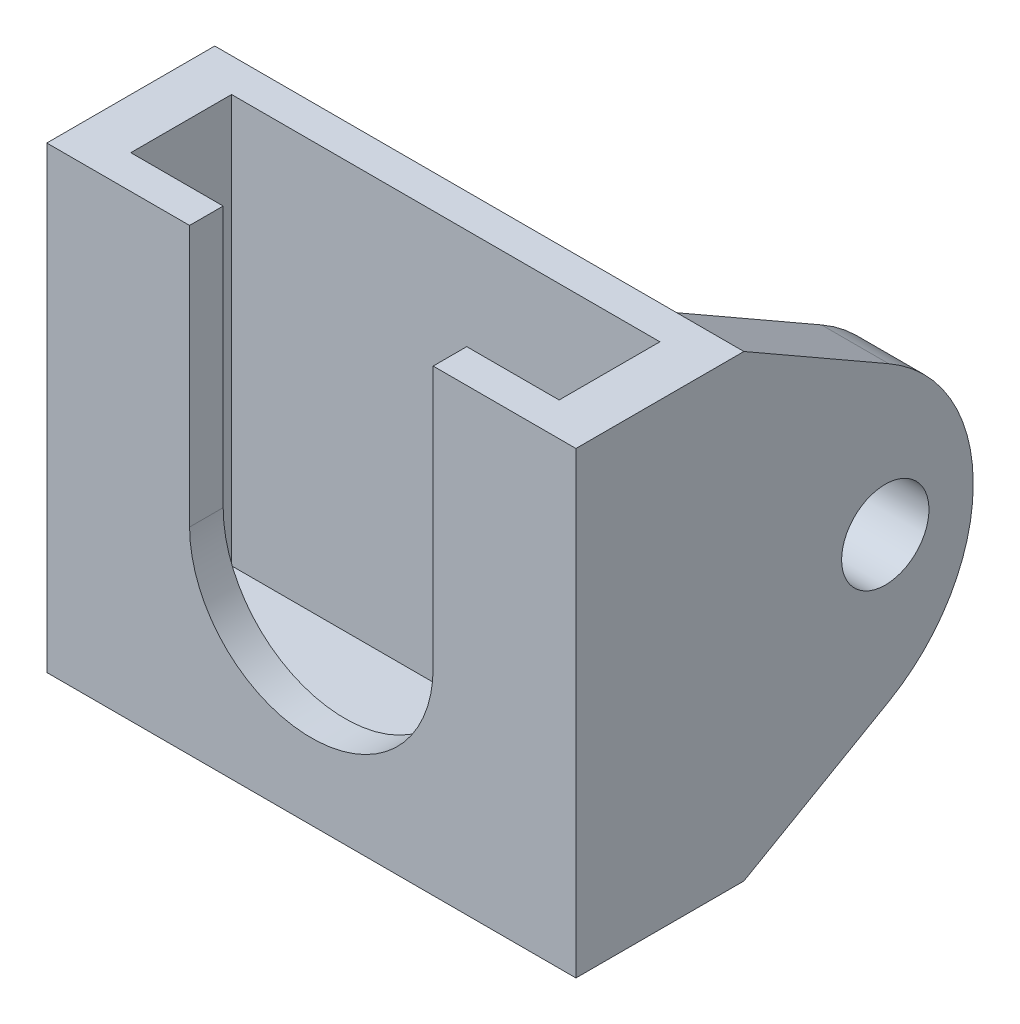
ISO-10303-21;
HEADER;
FILE_DESCRIPTION(('STEP AP214'),'2;1');
FILE_NAME('part.step','',(''),(''),'','','');
FILE_SCHEMA(('AUTOMOTIVE_DESIGN { 1 0 10303 214 1 1 1 1 }'));
ENDSEC;
DATA;
#1=APPLICATION_CONTEXT('core data for automotive mechanical design processes');
#2=APPLICATION_PROTOCOL_DEFINITION('international standard','automotive_design',2000,#1);
#3=PRODUCT_CONTEXT('',#1,'mechanical');
#4=PRODUCT('Part','Part','',(#3));
#5=PRODUCT_RELATED_PRODUCT_CATEGORY('part','',(#4));
#6=PRODUCT_DEFINITION_FORMATION('','',#4);
#7=PRODUCT_DEFINITION_CONTEXT('part definition',#1,'design');
#8=PRODUCT_DEFINITION('design','',#6,#7);
#9=PRODUCT_DEFINITION_SHAPE('','',#8);
#10=(LENGTH_UNIT() NAMED_UNIT(*) SI_UNIT(.MILLI.,.METRE.));
#11=(NAMED_UNIT(*) PLANE_ANGLE_UNIT() SI_UNIT($,.RADIAN.));
#12=(NAMED_UNIT(*) SI_UNIT($,.STERADIAN.) SOLID_ANGLE_UNIT());
#13=UNCERTAINTY_MEASURE_WITH_UNIT(LENGTH_MEASURE(1.E-05),#10,'distance_accuracy_value','');
#14=(GEOMETRIC_REPRESENTATION_CONTEXT(3) GLOBAL_UNCERTAINTY_ASSIGNED_CONTEXT((#13)) GLOBAL_UNIT_ASSIGNED_CONTEXT((#10,
#11,#12)) REPRESENTATION_CONTEXT('',''));
#15=CARTESIAN_POINT('',(0.,0.,0.));
#16=DIRECTION('',(0.,0.,1.));
#17=DIRECTION('',(1.,0.,0.));
#18=AXIS2_PLACEMENT_3D('',#15,#16,#17);
#19=CARTESIAN_POINT('',(28.5,-3.,6.));
#20=DIRECTION('',(-1.,0.,0.));
#21=DIRECTION('',(0.,0.,1.));
#22=AXIS2_PLACEMENT_3D('',#19,#20,#21);
#23=PLANE('',#22);
#24=CARTESIAN_POINT('',(28.5,10.65,-10.4161328959576));
#25=DIRECTION('',(-1.,0.,0.));
#26=DIRECTION('',(0.,0.,1.));
#27=AXIS2_PLACEMENT_3D('',#24,#25,#26);
#28=CIRCLE('',#27,2.6);
#29=CARTESIAN_POINT('',(28.5,10.65,-7.81613289595758));
#30=VERTEX_POINT('',#29);
#31=EDGE_CURVE('E163',#30,#30,#28,.T.);
#32=ORIENTED_EDGE('',*,*,#31,.T.);
#33=EDGE_LOOP('',(#32));
#34=FACE_BOUND('',#33,.T.);
#35=DIRECTION('',(0.,0.49706783095096,-0.867711686814064));
#36=VECTOR('',#35,1.);
#37=CARTESIAN_POINT('',(28.5,-6.45049252844372,4.02338857146966));
#38=LINE('',#37,#36);
#39=CARTESIAN_POINT('',(28.5,-3.,-2.));
#40=VERTEX_POINT('',#39);
#41=CARTESIAN_POINT('',(28.5,1.93825342620143,-10.6205140295778));
#42=VERTEX_POINT('',#41);
#43=EDGE_CURVE('E189',#40,#42,#38,.T.);
#44=ORIENTED_EDGE('',*,*,#43,.T.);
#45=CARTESIAN_POINT('',(28.5,10.6153702943421,-5.64983572006824));
#46=DIRECTION('',(-1.,0.,0.));
#47=DIRECTION('',(0.,0.,1.));
#48=AXIS2_PLACEMENT_3D('',#45,#46,#47);
#49=CIRCLE('',#48,10.);
#50=CARTESIAN_POINT('',(28.5,10.5204943884299,-15.6493856380634));
#51=VERTEX_POINT('',#50);
#52=EDGE_CURVE('E41',#42,#51,#49,.F.);
#53=ORIENTED_EDGE('',*,*,#52,.T.);
#54=CARTESIAN_POINT('',(28.5,10.65,-2.));
#55=DIRECTION('',(-1.,0.,0.));
#56=DIRECTION('',(0.,0.,1.));
#57=AXIS2_PLACEMENT_3D('',#54,#55,#56);
#58=CIRCLE('',#57,13.65);
#59=CARTESIAN_POINT('',(28.5,10.7795056115701,-15.6493856380634));
#60=VERTEX_POINT('',#59);
#61=EDGE_CURVE('E290',#51,#60,#58,.F.);
#62=ORIENTED_EDGE('',*,*,#61,.T.);
#63=CARTESIAN_POINT('',(28.5,10.6846297056579,-5.64983572006824));
#64=DIRECTION('',(-1.,0.,0.));
#65=DIRECTION('',(0.,0.,1.));
#66=AXIS2_PLACEMENT_3D('',#63,#64,#65);
#67=CIRCLE('',#66,10.);
#68=CARTESIAN_POINT('',(28.5,19.3617465737986,-10.6205140295778));
#69=VERTEX_POINT('',#68);
#70=EDGE_CURVE('E48',#60,#69,#67,.F.);
#71=ORIENTED_EDGE('',*,*,#70,.T.);
#72=DIRECTION('',(0.,0.49706783095096,0.867711686814064));
#73=VECTOR('',#72,1.);
#74=CARTESIAN_POINT('',(28.5,21.005306028584,-7.75141718184455));
#75=LINE('',#74,#73);
#76=CARTESIAN_POINT('',(28.5,24.3,-2.00000000000002));
#77=VERTEX_POINT('',#76);
#78=EDGE_CURVE('E193',#69,#77,#75,.T.);
#79=ORIENTED_EDGE('',*,*,#78,.T.);
#80=DIRECTION('',(0.,0.,1.));
#81=VECTOR('',#80,1.);
#82=CARTESIAN_POINT('',(28.5,24.3,-55.));
#83=LINE('',#82,#81);
#84=CARTESIAN_POINT('',(28.5,24.3,8.));
#85=VERTEX_POINT('',#84);
#86=EDGE_CURVE('E171',#77,#85,#83,.T.);
#87=ORIENTED_EDGE('',*,*,#86,.T.);
#88=DIRECTION('',(0.,1.,0.));
#89=VECTOR('',#88,1.);
#90=CARTESIAN_POINT('',(28.5,24.3,8.));
#91=LINE('',#90,#89);
#92=CARTESIAN_POINT('',(28.5,-3.,8.));
#93=VERTEX_POINT('',#92);
#94=EDGE_CURVE('E204',#93,#85,#91,.T.);
#95=ORIENTED_EDGE('',*,*,#94,.F.);
#96=DIRECTION('',(0.,0.,-1.));
#97=VECTOR('',#96,1.);
#98=CARTESIAN_POINT('',(28.5,-3.,6.));
#99=LINE('',#98,#97);
#100=EDGE_CURVE('E183',#93,#40,#99,.T.);
#101=ORIENTED_EDGE('',*,*,#100,.T.);
#102=EDGE_LOOP('',(#44,#53,#62,#71,#79,#87,#95,#101));
#103=FACE_BOUND('',#102,.T.);
#104=ADVANCED_FACE('F33',(#34,#103),#23,.F.);
#105=CARTESIAN_POINT('',(24.5,24.3,-40.));
#106=DIRECTION('',(1.,0.,0.));
#107=DIRECTION('',(0.,1.,0.));
#108=AXIS2_PLACEMENT_3D('',#105,#106,#107);
#109=PLANE('',#108);
#110=CARTESIAN_POINT('',(24.5,10.65,-10.4161328959576));
#111=DIRECTION('',(-1.,0.,0.));
#112=DIRECTION('',(0.,-1.,0.));
#113=AXIS2_PLACEMENT_3D('',#110,#111,#112);
#114=CIRCLE('',#113,2.6);
#115=CARTESIAN_POINT('',(24.5,8.05,-10.4161328959576));
#116=VERTEX_POINT('',#115);
#117=EDGE_CURVE('E297',#116,#116,#114,.T.);
#118=ORIENTED_EDGE('',*,*,#117,.F.);
#119=EDGE_LOOP('',(#118));
#120=FACE_BOUND('',#119,.T.);
#121=CARTESIAN_POINT('',(24.5,10.65,-2.));
#122=DIRECTION('',(-1.,0.,0.));
#123=DIRECTION('',(0.,-1.,0.));
#124=AXIS2_PLACEMENT_3D('',#121,#122,#123);
#125=CIRCLE('',#124,13.65);
#126=CARTESIAN_POINT('',(24.5,10.5204943884299,-15.6493856380634));
#127=VERTEX_POINT('',#126);
#128=CARTESIAN_POINT('',(24.5,10.7795056115701,-15.6493856380634));
#129=VERTEX_POINT('',#128);
#130=EDGE_CURVE('E298',#127,#129,#125,.F.);
#131=ORIENTED_EDGE('',*,*,#130,.F.);
#132=CARTESIAN_POINT('',(24.5,10.6153702943421,-5.64983572006824));
#133=DIRECTION('',(1.,0.,0.));
#134=DIRECTION('',(0.,1.,0.));
#135=AXIS2_PLACEMENT_3D('',#132,#133,#134);
#136=CIRCLE('',#135,10.);
#137=CARTESIAN_POINT('',(24.5,1.93825342620143,-10.6205140295778));
#138=VERTEX_POINT('',#137);
#139=EDGE_CURVE('E285',#127,#138,#136,.F.);
#140=ORIENTED_EDGE('',*,*,#139,.T.);
#141=DIRECTION('',(0.,0.49706783095096,-0.867711686814064));
#142=VECTOR('',#141,1.);
#143=CARTESIAN_POINT('',(24.5,6.06613932018376,-17.8264014538171));
#144=LINE('',#143,#142);
#145=CARTESIAN_POINT('',(24.5,-3.,-2.));
#146=VERTEX_POINT('',#145);
#147=EDGE_CURVE('E162',#146,#138,#144,.T.);
#148=ORIENTED_EDGE('',*,*,#147,.F.);
#149=DIRECTION('',(0.,1.,0.));
#150=VECTOR('',#149,1.);
#151=CARTESIAN_POINT('',(24.5,24.3,-2.));
#152=LINE('',#151,#150);
#153=CARTESIAN_POINT('',(24.5,24.3,-2.00000000000002));
#154=VERTEX_POINT('',#153);
#155=EDGE_CURVE('E178',#146,#154,#152,.T.);
#156=ORIENTED_EDGE('',*,*,#155,.T.);
#157=DIRECTION('',(0.,0.49706783095096,0.867711686814064));
#158=VECTOR('',#157,1.);
#159=CARTESIAN_POINT('',(24.5,24.3,-2.00000000000002));
#160=LINE('',#159,#158);
#161=CARTESIAN_POINT('',(24.5,19.3617465737986,-10.6205140295778));
#162=VERTEX_POINT('',#161);
#163=EDGE_CURVE('E154',#162,#154,#160,.T.);
#164=ORIENTED_EDGE('',*,*,#163,.F.);
#165=CARTESIAN_POINT('',(24.5,10.6846297056579,-5.64983572006824));
#166=DIRECTION('',(1.,0.,0.));
#167=DIRECTION('',(0.,1.,0.));
#168=AXIS2_PLACEMENT_3D('',#165,#166,#167);
#169=CIRCLE('',#168,10.);
#170=EDGE_CURVE('E283',#162,#129,#169,.F.);
#171=ORIENTED_EDGE('',*,*,#170,.T.);
#172=EDGE_LOOP('',(#131,#140,#148,#156,#164,#171));
#173=FACE_BOUND('',#172,.T.);
#174=ADVANCED_FACE('F187',(#120,#173),#109,.F.);
#175=CARTESIAN_POINT('',(-3.,-3.,6.));
#176=DIRECTION('',(0.,1.,0.));
#177=DIRECTION('',(0.,0.,1.));
#178=AXIS2_PLACEMENT_3D('',#175,#176,#177);
#179=PLANE('',#178);
#180=DIRECTION('',(-1.,0.,0.));
#181=VECTOR('',#180,1.);
#182=CARTESIAN_POINT('',(28.5,-3.,-2.));
#183=LINE('',#182,#181);
#184=CARTESIAN_POINT('',(-3.,-3.,-2.));
#185=VERTEX_POINT('',#184);
#186=EDGE_CURVE('E239',#146,#185,#183,.T.);
#187=ORIENTED_EDGE('',*,*,#186,.F.);
#188=DIRECTION('',(-1.,0.,0.));
#189=VECTOR('',#188,1.);
#190=CARTESIAN_POINT('',(62.5,-3.,-2.));
#191=LINE('',#190,#189);
#192=EDGE_CURVE('E172',#40,#146,#191,.T.);
#193=ORIENTED_EDGE('',*,*,#192,.F.);
#194=ORIENTED_EDGE('',*,*,#100,.F.);
#195=DIRECTION('',(1.,0.,0.));
#196=VECTOR('',#195,1.);
#197=CARTESIAN_POINT('',(-3.,-3.,8.));
#198=LINE('',#197,#196);
#199=CARTESIAN_POINT('',(-3.,-3.,8.));
#200=VERTEX_POINT('',#199);
#201=EDGE_CURVE('E200',#200,#93,#198,.T.);
#202=ORIENTED_EDGE('',*,*,#201,.F.);
#203=DIRECTION('',(0.,0.,-1.));
#204=VECTOR('',#203,1.);
#205=CARTESIAN_POINT('',(-3.,-3.,6.));
#206=LINE('',#205,#204);
#207=EDGE_CURVE('E274',#200,#185,#206,.T.);
#208=ORIENTED_EDGE('',*,*,#207,.T.);
#209=EDGE_LOOP('',(#187,#193,#194,#202,#208));
#210=FACE_BOUND('',#209,.T.);
#211=ADVANCED_FACE('F331',(#210),#179,.F.);
#212=CARTESIAN_POINT('',(-3.,-3.,6.));
#213=DIRECTION('',(1.,0.,0.));
#214=DIRECTION('',(0.,0.,-1.));
#215=AXIS2_PLACEMENT_3D('',#212,#213,#214);
#216=PLANE('',#215);
#217=ORIENTED_EDGE('',*,*,#207,.F.);
#218=DIRECTION('',(0.,-1.,0.));
#219=VECTOR('',#218,1.);
#220=CARTESIAN_POINT('',(-3.,24.3,8.));
#221=LINE('',#220,#219);
#222=CARTESIAN_POINT('',(-3.,24.3,8.));
#223=VERTEX_POINT('',#222);
#224=EDGE_CURVE('E197',#223,#200,#221,.T.);
#225=ORIENTED_EDGE('',*,*,#224,.F.);
#226=DIRECTION('',(0.,0.,1.));
#227=VECTOR('',#226,1.);
#228=CARTESIAN_POINT('',(-3.,24.3,-55.));
#229=LINE('',#228,#227);
#230=CARTESIAN_POINT('',(-3.,24.3,-2.00000000000002));
#231=VERTEX_POINT('',#230);
#232=EDGE_CURVE('E237',#231,#223,#229,.T.);
#233=ORIENTED_EDGE('',*,*,#232,.F.);
#234=DIRECTION('',(0.,1.,0.));
#235=VECTOR('',#234,1.);
#236=CARTESIAN_POINT('',(-3.,27.3,-2.));
#237=LINE('',#236,#235);
#238=EDGE_CURVE('E181',#185,#231,#237,.T.);
#239=ORIENTED_EDGE('',*,*,#238,.F.);
#240=EDGE_LOOP('',(#217,#225,#233,#239));
#241=FACE_BOUND('',#240,.T.);
#242=ADVANCED_FACE('F336',(#241),#216,.F.);
#243=CARTESIAN_POINT('',(0.,0.,6.));
#244=DIRECTION('',(1.,0.,0.));
#245=DIRECTION('',(0.,0.,-1.));
#246=AXIS2_PLACEMENT_3D('',#243,#244,#245);
#247=PLANE('',#246);
#248=DIRECTION('',(0.,-1.,0.));
#249=VECTOR('',#248,1.);
#250=CARTESIAN_POINT('',(0.,0.,0.));
#251=LINE('',#250,#249);
#252=CARTESIAN_POINT('',(0.,24.3,0.));
#253=VERTEX_POINT('',#252);
#254=CARTESIAN_POINT('',(0.,0.,0.));
#255=VERTEX_POINT('',#254);
#256=EDGE_CURVE('E243',#253,#255,#251,.T.);
#257=ORIENTED_EDGE('',*,*,#256,.F.);
#258=DIRECTION('',(0.,0.,-1.));
#259=VECTOR('',#258,1.);
#260=CARTESIAN_POINT('',(0.,24.3,6.));
#261=LINE('',#260,#259);
#262=CARTESIAN_POINT('',(0.,24.3,6.));
#263=VERTEX_POINT('',#262);
#264=EDGE_CURVE('E254',#263,#253,#261,.T.);
#265=ORIENTED_EDGE('',*,*,#264,.F.);
#266=DIRECTION('',(0.,-1.,0.));
#267=VECTOR('',#266,1.);
#268=CARTESIAN_POINT('',(0.,0.,6.));
#269=LINE('',#268,#267);
#270=CARTESIAN_POINT('',(0.,0.,6.));
#271=VERTEX_POINT('',#270);
#272=EDGE_CURVE('E244',#263,#271,#269,.T.);
#273=ORIENTED_EDGE('',*,*,#272,.T.);
#274=DIRECTION('',(0.,0.,-1.));
#275=VECTOR('',#274,1.);
#276=CARTESIAN_POINT('',(0.,0.,6.));
#277=LINE('',#276,#275);
#278=EDGE_CURVE('E271',#271,#255,#277,.T.);
#279=ORIENTED_EDGE('',*,*,#278,.T.);
#280=EDGE_LOOP('',(#257,#265,#273,#279));
#281=FACE_BOUND('',#280,.T.);
#282=ADVANCED_FACE('F485',(#281),#247,.T.);
#283=CARTESIAN_POINT('',(0.,0.,6.));
#284=DIRECTION('',(0.,1.,0.));
#285=DIRECTION('',(0.,0.,1.));
#286=AXIS2_PLACEMENT_3D('',#283,#284,#285);
#287=PLANE('',#286);
#288=DIRECTION('',(1.,0.,0.));
#289=VECTOR('',#288,1.);
#290=CARTESIAN_POINT('',(0.,0.,0.));
#291=LINE('',#290,#289);
#292=CARTESIAN_POINT('',(25.5,0.,0.));
#293=VERTEX_POINT('',#292);
#294=EDGE_CURVE('E257',#255,#293,#291,.T.);
#295=ORIENTED_EDGE('',*,*,#294,.F.);
#296=ORIENTED_EDGE('',*,*,#278,.F.);
#297=DIRECTION('',(1.,0.,0.));
#298=VECTOR('',#297,1.);
#299=CARTESIAN_POINT('',(0.,0.,6.));
#300=LINE('',#299,#298);
#301=CARTESIAN_POINT('',(25.5,0.,6.));
#302=VERTEX_POINT('',#301);
#303=EDGE_CURVE('E247',#271,#302,#300,.T.);
#304=ORIENTED_EDGE('',*,*,#303,.T.);
#305=DIRECTION('',(0.,0.,-1.));
#306=VECTOR('',#305,1.);
#307=CARTESIAN_POINT('',(25.5,0.,6.));
#308=LINE('',#307,#306);
#309=EDGE_CURVE('E269',#302,#293,#308,.T.);
#310=ORIENTED_EDGE('',*,*,#309,.T.);
#311=EDGE_LOOP('',(#295,#296,#304,#310));
#312=FACE_BOUND('',#311,.T.);
#313=ADVANCED_FACE('F474',(#312),#287,.T.);
#314=CARTESIAN_POINT('',(25.5,0.,6.));
#315=DIRECTION('',(-1.,0.,0.));
#316=DIRECTION('',(0.,0.,1.));
#317=AXIS2_PLACEMENT_3D('',#314,#315,#316);
#318=PLANE('',#317);
#319=DIRECTION('',(0.,1.,0.));
#320=VECTOR('',#319,1.);
#321=CARTESIAN_POINT('',(25.5,0.,0.));
#322=LINE('',#321,#320);
#323=CARTESIAN_POINT('',(25.5,24.3,0.));
#324=VERTEX_POINT('',#323);
#325=EDGE_CURVE('E260',#293,#324,#322,.T.);
#326=ORIENTED_EDGE('',*,*,#325,.F.);
#327=ORIENTED_EDGE('',*,*,#309,.F.);
#328=DIRECTION('',(0.,1.,0.));
#329=VECTOR('',#328,1.);
#330=CARTESIAN_POINT('',(25.5,0.,6.));
#331=LINE('',#330,#329);
#332=CARTESIAN_POINT('',(25.5,24.3,6.));
#333=VERTEX_POINT('',#332);
#334=EDGE_CURVE('E251',#302,#333,#331,.T.);
#335=ORIENTED_EDGE('',*,*,#334,.T.);
#336=DIRECTION('',(0.,0.,-1.));
#337=VECTOR('',#336,1.);
#338=CARTESIAN_POINT('',(25.5,24.3,6.));
#339=LINE('',#338,#337);
#340=EDGE_CURVE('E266',#333,#324,#339,.T.);
#341=ORIENTED_EDGE('',*,*,#340,.T.);
#342=EDGE_LOOP('',(#326,#327,#335,#341));
#343=FACE_BOUND('',#342,.T.);
#344=ADVANCED_FACE('F469',(#343),#318,.T.);
#345=CARTESIAN_POINT('',(0.,0.,0.));
#346=DIRECTION('',(0.,0.,-1.));
#347=DIRECTION('',(-1.,0.,0.));
#348=AXIS2_PLACEMENT_3D('',#345,#346,#347);
#349=PLANE('',#348);
#350=DIRECTION('',(-1.,0.,0.));
#351=VECTOR('',#350,1.);
#352=CARTESIAN_POINT('',(0.,24.3,0.));
#353=LINE('',#352,#351);
#354=EDGE_CURVE('E248',#324,#253,#353,.T.);
#355=ORIENTED_EDGE('',*,*,#354,.T.);
#356=ORIENTED_EDGE('',*,*,#256,.T.);
#357=ORIENTED_EDGE('',*,*,#294,.T.);
#358=ORIENTED_EDGE('',*,*,#325,.T.);
#359=EDGE_LOOP('',(#355,#356,#357,#358));
#360=FACE_BOUND('',#359,.T.);
#361=ADVANCED_FACE('F408',(#360),#349,.F.);
#362=CARTESIAN_POINT('',(0.,0.,-2.));
#363=DIRECTION('',(0.,0.,-1.));
#364=DIRECTION('',(-1.,0.,0.));
#365=AXIS2_PLACEMENT_3D('',#362,#363,#364);
#366=PLANE('',#365);
#367=ORIENTED_EDGE('',*,*,#155,.F.);
#368=ORIENTED_EDGE('',*,*,#186,.T.);
#369=ORIENTED_EDGE('',*,*,#238,.T.);
#370=DIRECTION('',(-1.,0.,0.));
#371=VECTOR('',#370,1.);
#372=CARTESIAN_POINT('',(0.,24.3,-2.));
#373=LINE('',#372,#371);
#374=EDGE_CURVE('E168',#154,#231,#373,.T.);
#375=ORIENTED_EDGE('',*,*,#374,.F.);
#376=EDGE_LOOP('',(#367,#368,#369,#375));
#377=FACE_BOUND('',#376,.T.);
#378=ADVANCED_FACE('F177',(#377),#366,.T.);
#379=CARTESIAN_POINT('',(0.,24.3,-55.));
#380=DIRECTION('',(0.,-1.,0.));
#381=DIRECTION('',(1.,0.,0.));
#382=AXIS2_PLACEMENT_3D('',#379,#380,#381);
#383=PLANE('',#382);
#384=ORIENTED_EDGE('',*,*,#86,.F.);
#385=DIRECTION('',(-1.,0.,0.));
#386=VECTOR('',#385,1.);
#387=CARTESIAN_POINT('',(62.5,24.3,-2.00000000000002));
#388=LINE('',#387,#386);
#389=EDGE_CURVE('E157',#77,#154,#388,.T.);
#390=ORIENTED_EDGE('',*,*,#389,.T.);
#391=ORIENTED_EDGE('',*,*,#374,.T.);
#392=ORIENTED_EDGE('',*,*,#232,.T.);
#393=DIRECTION('',(-1.,0.,0.));
#394=VECTOR('',#393,1.);
#395=CARTESIAN_POINT('',(-3.,24.3,8.));
#396=LINE('',#395,#394);
#397=CARTESIAN_POINT('',(5.5,24.3,8.));
#398=VERTEX_POINT('',#397);
#399=EDGE_CURVE('E215',#398,#223,#396,.T.);
#400=ORIENTED_EDGE('',*,*,#399,.F.);
#401=DIRECTION('',(0.,0.,-1.));
#402=VECTOR('',#401,1.);
#403=CARTESIAN_POINT('',(5.5,24.3,8.));
#404=LINE('',#403,#402);
#405=CARTESIAN_POINT('',(5.5,24.3,6.));
#406=VERTEX_POINT('',#405);
#407=EDGE_CURVE('E217',#398,#406,#404,.T.);
#408=ORIENTED_EDGE('',*,*,#407,.T.);
#409=DIRECTION('',(-1.,0.,0.));
#410=VECTOR('',#409,1.);
#411=CARTESIAN_POINT('',(-3.,24.3,6.));
#412=LINE('',#411,#410);
#413=EDGE_CURVE('E201',#406,#263,#412,.T.);
#414=ORIENTED_EDGE('',*,*,#413,.T.);
#415=ORIENTED_EDGE('',*,*,#264,.T.);
#416=ORIENTED_EDGE('',*,*,#354,.F.);
#417=ORIENTED_EDGE('',*,*,#340,.F.);
#418=DIRECTION('',(-1.,0.,0.));
#419=VECTOR('',#418,1.);
#420=CARTESIAN_POINT('',(20.,24.3,6.));
#421=LINE('',#420,#419);
#422=CARTESIAN_POINT('',(20.,24.3,6.));
#423=VERTEX_POINT('',#422);
#424=EDGE_CURVE('E188',#333,#423,#421,.T.);
#425=ORIENTED_EDGE('',*,*,#424,.T.);
#426=DIRECTION('',(0.,0.,-1.));
#427=VECTOR('',#426,1.);
#428=CARTESIAN_POINT('',(20.,24.3,8.));
#429=LINE('',#428,#427);
#430=CARTESIAN_POINT('',(20.,24.3,8.));
#431=VERTEX_POINT('',#430);
#432=EDGE_CURVE('E234',#431,#423,#429,.T.);
#433=ORIENTED_EDGE('',*,*,#432,.F.);
#434=DIRECTION('',(-1.,0.,0.));
#435=VECTOR('',#434,1.);
#436=CARTESIAN_POINT('',(20.,24.3,8.));
#437=LINE('',#436,#435);
#438=EDGE_CURVE('E207',#85,#431,#437,.T.);
#439=ORIENTED_EDGE('',*,*,#438,.F.);
#440=EDGE_LOOP('',(#384,#390,#391,#392,#400,#408,#414,#415,#416,#417,#425,#433,#439));
#441=FACE_BOUND('',#440,.T.);
#442=ADVANCED_FACE('F167',(#441),#383,.F.);
#443=CARTESIAN_POINT('',(20.,8.75,8.));
#444=DIRECTION('',(1.,0.,0.));
#445=DIRECTION('',(0.,0.,-1.));
#446=AXIS2_PLACEMENT_3D('',#443,#444,#445);
#447=PLANE('',#446);
#448=DIRECTION('',(0.,-1.,0.));
#449=VECTOR('',#448,1.);
#450=CARTESIAN_POINT('',(20.,8.75,6.));
#451=LINE('',#450,#449);
#452=CARTESIAN_POINT('',(20.,8.75,6.));
#453=VERTEX_POINT('',#452);
#454=EDGE_CURVE('E191',#423,#453,#451,.T.);
#455=ORIENTED_EDGE('',*,*,#454,.T.);
#456=DIRECTION('',(0.,0.,-1.));
#457=VECTOR('',#456,1.);
#458=CARTESIAN_POINT('',(20.,8.75,8.));
#459=LINE('',#458,#457);
#460=CARTESIAN_POINT('',(20.,8.75,8.));
#461=VERTEX_POINT('',#460);
#462=EDGE_CURVE('E231',#461,#453,#459,.T.);
#463=ORIENTED_EDGE('',*,*,#462,.F.);
#464=DIRECTION('',(0.,-1.,0.));
#465=VECTOR('',#464,1.);
#466=CARTESIAN_POINT('',(20.,8.75,8.));
#467=LINE('',#466,#465);
#468=EDGE_CURVE('E209',#431,#461,#467,.T.);
#469=ORIENTED_EDGE('',*,*,#468,.F.);
#470=ORIENTED_EDGE('',*,*,#432,.T.);
#471=EDGE_LOOP('',(#455,#463,#469,#470));
#472=FACE_BOUND('',#471,.T.);
#473=ADVANCED_FACE('F396',(#472),#447,.F.);
#474=CARTESIAN_POINT('',(12.75,8.75,8.));
#475=DIRECTION('',(0.,0.,-1.));
#476=DIRECTION('',(-1.,0.,0.));
#477=AXIS2_PLACEMENT_3D('',#474,#475,#476);
#478=CYLINDRICAL_SURFACE('',#477,7.25);
#479=CARTESIAN_POINT('',(12.75,8.75,6.));
#480=DIRECTION('',(0.,0.,-1.));
#481=DIRECTION('',(1.,0.,0.));
#482=AXIS2_PLACEMENT_3D('',#479,#480,#481);
#483=CIRCLE('',#482,7.25);
#484=CARTESIAN_POINT('',(5.5,8.75,6.));
#485=VERTEX_POINT('',#484);
#486=EDGE_CURVE('E220',#453,#485,#483,.T.);
#487=ORIENTED_EDGE('',*,*,#486,.T.);
#488=DIRECTION('',(0.,0.,-1.));
#489=VECTOR('',#488,1.);
#490=CARTESIAN_POINT('',(5.5,8.75,8.));
#491=LINE('',#490,#489);
#492=CARTESIAN_POINT('',(5.5,8.75,8.));
#493=VERTEX_POINT('',#492);
#494=EDGE_CURVE('E228',#493,#485,#491,.T.);
#495=ORIENTED_EDGE('',*,*,#494,.F.);
#496=CARTESIAN_POINT('',(12.75,8.75,8.));
#497=DIRECTION('',(0.,0.,-1.));
#498=DIRECTION('',(1.,0.,0.));
#499=AXIS2_PLACEMENT_3D('',#496,#497,#498);
#500=CIRCLE('',#499,7.25);
#501=EDGE_CURVE('E211',#461,#493,#500,.T.);
#502=ORIENTED_EDGE('',*,*,#501,.F.);
#503=ORIENTED_EDGE('',*,*,#462,.T.);
#504=EDGE_LOOP('',(#487,#495,#502,#503));
#505=FACE_BOUND('',#504,.T.);
#506=ADVANCED_FACE('F446',(#505),#478,.F.);
#507=CARTESIAN_POINT('',(5.5,8.75,8.));
#508=DIRECTION('',(-1.,0.,0.));
#509=DIRECTION('',(0.,-1.,0.));
#510=AXIS2_PLACEMENT_3D('',#507,#508,#509);
#511=PLANE('',#510);
#512=DIRECTION('',(0.,1.,0.));
#513=VECTOR('',#512,1.);
#514=CARTESIAN_POINT('',(5.5,8.75,6.));
#515=LINE('',#514,#513);
#516=EDGE_CURVE('E222',#485,#406,#515,.T.);
#517=ORIENTED_EDGE('',*,*,#516,.T.);
#518=ORIENTED_EDGE('',*,*,#407,.F.);
#519=DIRECTION('',(0.,1.,0.));
#520=VECTOR('',#519,1.);
#521=CARTESIAN_POINT('',(5.5,8.75,8.));
#522=LINE('',#521,#520);
#523=EDGE_CURVE('E213',#493,#398,#522,.T.);
#524=ORIENTED_EDGE('',*,*,#523,.F.);
#525=ORIENTED_EDGE('',*,*,#494,.T.);
#526=EDGE_LOOP('',(#517,#518,#524,#525));
#527=FACE_BOUND('',#526,.T.);
#528=ADVANCED_FACE('F436',(#527),#511,.F.);
#529=CARTESIAN_POINT('',(12.75,8.75,8.));
#530=DIRECTION('',(0.,0.,1.));
#531=DIRECTION('',(1.,0.,0.));
#532=AXIS2_PLACEMENT_3D('',#529,#530,#531);
#533=PLANE('',#532);
#534=ORIENTED_EDGE('',*,*,#224,.T.);
#535=ORIENTED_EDGE('',*,*,#201,.T.);
#536=ORIENTED_EDGE('',*,*,#94,.T.);
#537=ORIENTED_EDGE('',*,*,#438,.T.);
#538=ORIENTED_EDGE('',*,*,#468,.T.);
#539=ORIENTED_EDGE('',*,*,#501,.T.);
#540=ORIENTED_EDGE('',*,*,#523,.T.);
#541=ORIENTED_EDGE('',*,*,#399,.T.);
#542=EDGE_LOOP('',(#534,#535,#536,#537,#538,#539,#540,#541));
#543=FACE_BOUND('',#542,.T.);
#544=ADVANCED_FACE('F426',(#543),#533,.T.);
#545=CARTESIAN_POINT('',(12.75,8.75,6.));
#546=DIRECTION('',(0.,0.,1.));
#547=DIRECTION('',(1.,0.,0.));
#548=AXIS2_PLACEMENT_3D('',#545,#546,#547);
#549=PLANE('',#548);
#550=ORIENTED_EDGE('',*,*,#334,.F.);
#551=ORIENTED_EDGE('',*,*,#303,.F.);
#552=ORIENTED_EDGE('',*,*,#272,.F.);
#553=ORIENTED_EDGE('',*,*,#413,.F.);
#554=ORIENTED_EDGE('',*,*,#516,.F.);
#555=ORIENTED_EDGE('',*,*,#486,.F.);
#556=ORIENTED_EDGE('',*,*,#454,.F.);
#557=ORIENTED_EDGE('',*,*,#424,.F.);
#558=EDGE_LOOP('',(#550,#551,#552,#553,#554,#555,#556,#557));
#559=FACE_BOUND('',#558,.T.);
#560=ADVANCED_FACE('F373',(#559),#549,.F.);
#561=CARTESIAN_POINT('',(62.5,6.06613932018376,-17.8264014538171));
#562=DIRECTION('',(0.,0.867711686814064,0.49706783095096));
#563=DIRECTION('',(0.,-0.49706783095096,0.867711686814064));
#564=AXIS2_PLACEMENT_3D('',#561,#562,#563);
#565=PLANE('',#564);
#566=ORIENTED_EDGE('',*,*,#147,.T.);
#567=DIRECTION('',(-1.,0.,0.));
#568=VECTOR('',#567,1.);
#569=CARTESIAN_POINT('',(62.5,1.93825342620143,-10.6205140295778));
#570=LINE('',#569,#568);
#571=EDGE_CURVE('E56',#138,#42,#570,.F.);
#572=ORIENTED_EDGE('',*,*,#571,.T.);
#573=ORIENTED_EDGE('',*,*,#43,.F.);
#574=ORIENTED_EDGE('',*,*,#192,.T.);
#575=EDGE_LOOP('',(#566,#572,#573,#574));
#576=FACE_BOUND('',#575,.T.);
#577=ADVANCED_FACE('F301',(#576),#565,.F.);
#578=CARTESIAN_POINT('',(62.5,24.3,-2.00000000000002));
#579=DIRECTION('',(0.,-0.867711686814064,0.49706783095096));
#580=DIRECTION('',(0.,-0.49706783095096,-0.867711686814064));
#581=AXIS2_PLACEMENT_3D('',#578,#579,#580);
#582=PLANE('',#581);
#583=ORIENTED_EDGE('',*,*,#78,.F.);
#584=DIRECTION('',(-1.,0.,0.));
#585=VECTOR('',#584,1.);
#586=CARTESIAN_POINT('',(62.5,19.3617465737986,-10.6205140295778));
#587=LINE('',#586,#585);
#588=EDGE_CURVE('E11',#69,#162,#587,.T.);
#589=ORIENTED_EDGE('',*,*,#588,.T.);
#590=ORIENTED_EDGE('',*,*,#163,.T.);
#591=ORIENTED_EDGE('',*,*,#389,.F.);
#592=EDGE_LOOP('',(#583,#589,#590,#591));
#593=FACE_BOUND('',#592,.T.);
#594=ADVANCED_FACE('F156',(#593),#582,.F.);
#595=CARTESIAN_POINT('',(62.5,10.65,-10.4161328959576));
#596=DIRECTION('',(-1.,0.,0.));
#597=DIRECTION('',(0.,-1.,0.));
#598=AXIS2_PLACEMENT_3D('',#595,#596,#597);
#599=CYLINDRICAL_SURFACE('',#598,2.6);
#600=ORIENTED_EDGE('',*,*,#117,.T.);
#601=EDGE_LOOP('',(#600));
#602=FACE_BOUND('',#601,.T.);
#603=ORIENTED_EDGE('',*,*,#31,.F.);
#604=EDGE_LOOP('',(#603));
#605=FACE_BOUND('',#604,.T.);
#606=ADVANCED_FACE('F315',(#602,#605),#599,.F.);
#607=CARTESIAN_POINT('',(62.5,10.65,-2.));
#608=DIRECTION('',(-1.,0.,0.));
#609=DIRECTION('',(0.,-1.,0.));
#610=AXIS2_PLACEMENT_3D('',#607,#608,#609);
#611=CYLINDRICAL_SURFACE('',#610,13.65);
#612=ORIENTED_EDGE('',*,*,#61,.F.);
#613=DIRECTION('',(-1.,0.,0.));
#614=VECTOR('',#613,1.);
#615=CARTESIAN_POINT('',(62.5,10.5204943884299,-15.6493856380634));
#616=LINE('',#615,#614);
#617=EDGE_CURVE('E280',#51,#127,#616,.T.);
#618=ORIENTED_EDGE('',*,*,#617,.T.);
#619=ORIENTED_EDGE('',*,*,#130,.T.);
#620=DIRECTION('',(-1.,0.,0.));
#621=VECTOR('',#620,1.);
#622=CARTESIAN_POINT('',(62.5,10.7795056115701,-15.6493856380634));
#623=LINE('',#622,#621);
#624=EDGE_CURVE('E182',#129,#60,#623,.F.);
#625=ORIENTED_EDGE('',*,*,#624,.T.);
#626=EDGE_LOOP('',(#612,#618,#619,#625));
#627=FACE_BOUND('',#626,.T.);
#628=ADVANCED_FACE('F294',(#627),#611,.T.);
#629=CARTESIAN_POINT('',(62.5,10.6153702943421,-5.64983572006824));
#630=DIRECTION('',(-1.,0.,0.));
#631=DIRECTION('',(0.,-1.,0.));
#632=AXIS2_PLACEMENT_3D('',#629,#630,#631);
#633=CYLINDRICAL_SURFACE('',#632,10.);
#634=ORIENTED_EDGE('',*,*,#52,.F.);
#635=ORIENTED_EDGE('',*,*,#571,.F.);
#636=ORIENTED_EDGE('',*,*,#139,.F.);
#637=ORIENTED_EDGE('',*,*,#617,.F.);
#638=EDGE_LOOP('',(#634,#635,#636,#637));
#639=FACE_BOUND('',#638,.T.);
#640=ADVANCED_FACE('F300',(#639),#633,.T.);
#641=CARTESIAN_POINT('',(62.5,10.6846297056579,-5.64983572006824));
#642=DIRECTION('',(-1.,0.,0.));
#643=DIRECTION('',(0.,-1.,0.));
#644=AXIS2_PLACEMENT_3D('',#641,#642,#643);
#645=CYLINDRICAL_SURFACE('',#644,10.);
#646=ORIENTED_EDGE('',*,*,#70,.F.);
#647=ORIENTED_EDGE('',*,*,#624,.F.);
#648=ORIENTED_EDGE('',*,*,#170,.F.);
#649=ORIENTED_EDGE('',*,*,#588,.F.);
#650=EDGE_LOOP('',(#646,#647,#648,#649));
#651=FACE_BOUND('',#650,.T.);
#652=ADVANCED_FACE('F35',(#651),#645,.T.);
#653=CLOSED_SHELL('',(#104,#174,#211,#242,#282,#313,#344,#361,#378,#442,#473,#506,#528,#544,
#560,#577,#594,#606,#628,#640,#652));
#654=MANIFOLD_SOLID_BREP('B2',#653);
#655=ADVANCED_BREP_SHAPE_REPRESENTATION('',(#18,#654),#14);
#656=SHAPE_DEFINITION_REPRESENTATION(#9,#655);
ENDSEC;
END-ISO-10303-21;
